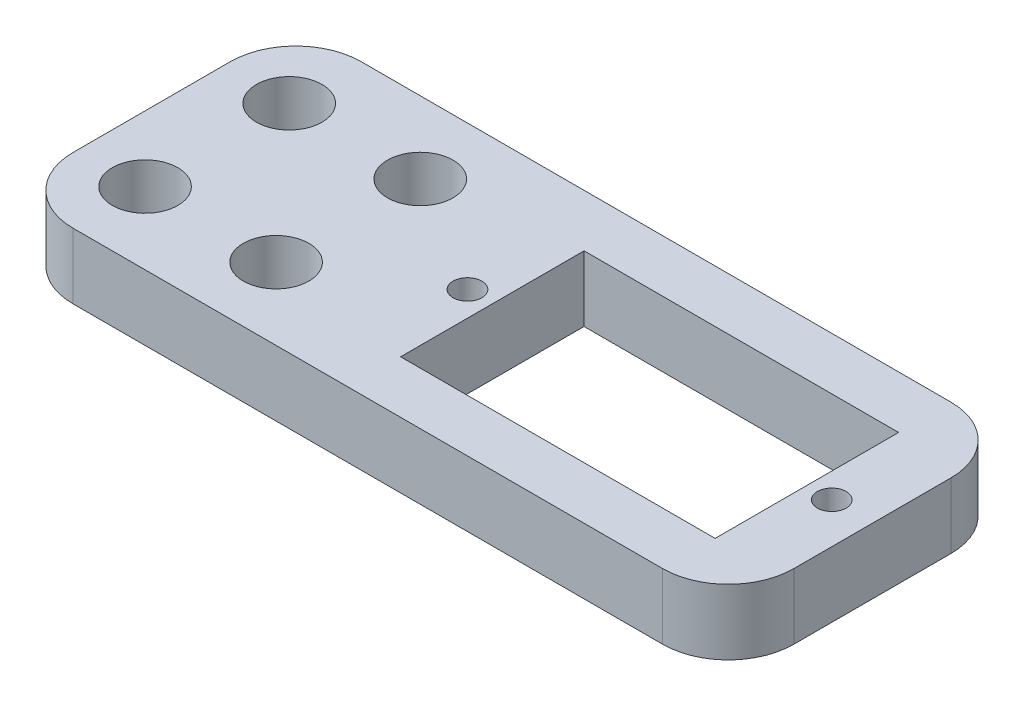
ISO-10303-21;
HEADER;
FILE_DESCRIPTION(('STEP AP214'),'2;1');
FILE_NAME('part.step','',(''),(''),'','','');
FILE_SCHEMA(('AUTOMOTIVE_DESIGN { 1 0 10303 214 1 1 1 1 }'));
ENDSEC;
DATA;
#1=APPLICATION_CONTEXT('core data for automotive mechanical design processes');
#2=APPLICATION_PROTOCOL_DEFINITION('international standard','automotive_design',2000,#1);
#3=PRODUCT_CONTEXT('',#1,'mechanical');
#4=PRODUCT('Part','Part','',(#3));
#5=PRODUCT_RELATED_PRODUCT_CATEGORY('part','',(#4));
#6=PRODUCT_DEFINITION_FORMATION('','',#4);
#7=PRODUCT_DEFINITION_CONTEXT('part definition',#1,'design');
#8=PRODUCT_DEFINITION('design','',#6,#7);
#9=PRODUCT_DEFINITION_SHAPE('','',#8);
#10=(LENGTH_UNIT() NAMED_UNIT(*) SI_UNIT(.MILLI.,.METRE.));
#11=(NAMED_UNIT(*) PLANE_ANGLE_UNIT() SI_UNIT($,.RADIAN.));
#12=(NAMED_UNIT(*) SI_UNIT($,.STERADIAN.) SOLID_ANGLE_UNIT());
#13=UNCERTAINTY_MEASURE_WITH_UNIT(LENGTH_MEASURE(1.E-05),#10,'distance_accuracy_value','');
#14=(GEOMETRIC_REPRESENTATION_CONTEXT(3) GLOBAL_UNCERTAINTY_ASSIGNED_CONTEXT((#13)) GLOBAL_UNIT_ASSIGNED_CONTEXT((#10,
#11,#12)) REPRESENTATION_CONTEXT('',''));
#15=CARTESIAN_POINT('',(0.,0.,0.));
#16=DIRECTION('',(0.,0.,1.));
#17=DIRECTION('',(1.,0.,0.));
#18=AXIS2_PLACEMENT_3D('',#15,#16,#17);
#19=CARTESIAN_POINT('',(0.,5.,0.));
#20=DIRECTION('',(0.,-1.,0.));
#21=DIRECTION('',(0.,0.,-1.));
#22=AXIS2_PLACEMENT_3D('',#19,#20,#21);
#23=PLANE('',#22);
#24=CARTESIAN_POINT('',(21.9,5.,0.));
#25=DIRECTION('',(0.,1.,0.));
#26=DIRECTION('',(0.,0.,1.));
#27=AXIS2_PLACEMENT_3D('',#24,#25,#26);
#28=CIRCLE('',#27,1.1);
#29=CARTESIAN_POINT('',(21.9,5.,1.1));
#30=VERTEX_POINT('',#29);
#31=EDGE_CURVE('E414',#30,#30,#28,.T.);
#32=ORIENTED_EDGE('',*,*,#31,.F.);
#33=EDGE_LOOP('',(#32));
#34=FACE_BOUND('',#33,.T.);
#35=CARTESIAN_POINT('',(-15.,5.,-5.5));
#36=DIRECTION('',(0.,1.,0.));
#37=DIRECTION('',(0.,0.,1.));
#38=AXIS2_PLACEMENT_3D('',#35,#36,#37);
#39=CIRCLE('',#38,2.5);
#40=CARTESIAN_POINT('',(-15.,5.,-3.));
#41=VERTEX_POINT('',#40);
#42=EDGE_CURVE('E173',#41,#41,#39,.F.);
#43=ORIENTED_EDGE('',*,*,#42,.T.);
#44=EDGE_LOOP('',(#43));
#45=FACE_BOUND('',#44,.T.);
#46=CARTESIAN_POINT('',(-25.,5.,5.5));
#47=DIRECTION('',(0.,1.,0.));
#48=DIRECTION('',(0.,0.,1.));
#49=AXIS2_PLACEMENT_3D('',#46,#47,#48);
#50=CIRCLE('',#49,2.5);
#51=CARTESIAN_POINT('',(-25.,5.,8.));
#52=VERTEX_POINT('',#51);
#53=EDGE_CURVE('E166',#52,#52,#50,.F.);
#54=ORIENTED_EDGE('',*,*,#53,.T.);
#55=EDGE_LOOP('',(#54));
#56=FACE_BOUND('',#55,.T.);
#57=DIRECTION('',(-1.,0.,0.));
#58=VECTOR('',#57,1.);
#59=CARTESIAN_POINT('',(-30.,5.,-11.));
#60=LINE('',#59,#58);
#61=CARTESIAN_POINT('',(20.,5.,-11.));
#62=VERTEX_POINT('',#61);
#63=CARTESIAN_POINT('',(-25.,5.,-11.));
#64=VERTEX_POINT('',#63);
#65=EDGE_CURVE('E197',#62,#64,#60,.T.);
#66=ORIENTED_EDGE('',*,*,#65,.T.);
#67=CARTESIAN_POINT('',(-25.,5.,-6.));
#68=DIRECTION('',(0.,-1.,0.));
#69=DIRECTION('',(0.,0.,-1.));
#70=AXIS2_PLACEMENT_3D('',#67,#68,#69);
#71=CIRCLE('',#70,5.);
#72=CARTESIAN_POINT('',(-30.,5.,-6.));
#73=VERTEX_POINT('',#72);
#74=EDGE_CURVE('E234',#64,#73,#71,.F.);
#75=ORIENTED_EDGE('',*,*,#74,.T.);
#76=DIRECTION('',(0.,0.,1.));
#77=VECTOR('',#76,1.);
#78=CARTESIAN_POINT('',(-30.,5.,11.));
#79=LINE('',#78,#77);
#80=CARTESIAN_POINT('',(-30.,5.,6.));
#81=VERTEX_POINT('',#80);
#82=EDGE_CURVE('E187',#73,#81,#79,.T.);
#83=ORIENTED_EDGE('',*,*,#82,.T.);
#84=CARTESIAN_POINT('',(-25.,5.,6.));
#85=DIRECTION('',(0.,-1.,0.));
#86=DIRECTION('',(0.,0.,-1.));
#87=AXIS2_PLACEMENT_3D('',#84,#85,#86);
#88=CIRCLE('',#87,5.);
#89=CARTESIAN_POINT('',(-25.,5.,11.));
#90=VERTEX_POINT('',#89);
#91=EDGE_CURVE('E232',#81,#90,#88,.F.);
#92=ORIENTED_EDGE('',*,*,#91,.T.);
#93=DIRECTION('',(1.,0.,0.));
#94=VECTOR('',#93,1.);
#95=CARTESIAN_POINT('',(-30.,5.,11.));
#96=LINE('',#95,#94);
#97=CARTESIAN_POINT('',(20.,5.,11.));
#98=VERTEX_POINT('',#97);
#99=EDGE_CURVE('E190',#90,#98,#96,.T.);
#100=ORIENTED_EDGE('',*,*,#99,.T.);
#101=CARTESIAN_POINT('',(20.,5.,5.99999999999999));
#102=DIRECTION('',(0.,-1.,0.));
#103=DIRECTION('',(0.,0.,-1.));
#104=AXIS2_PLACEMENT_3D('',#101,#102,#103);
#105=CIRCLE('',#104,5.);
#106=CARTESIAN_POINT('',(25.,5.,5.99999999999999));
#107=VERTEX_POINT('',#106);
#108=EDGE_CURVE('E228',#98,#107,#105,.F.);
#109=ORIENTED_EDGE('',*,*,#108,.T.);
#110=DIRECTION('',(0.,0.,-1.));
#111=VECTOR('',#110,1.);
#112=CARTESIAN_POINT('',(25.,5.,-11.));
#113=LINE('',#112,#111);
#114=CARTESIAN_POINT('',(25.,5.,-6.));
#115=VERTEX_POINT('',#114);
#116=EDGE_CURVE('E194',#107,#115,#113,.T.);
#117=ORIENTED_EDGE('',*,*,#116,.T.);
#118=CARTESIAN_POINT('',(20.,5.,-6.));
#119=DIRECTION('',(0.,-1.,0.));
#120=DIRECTION('',(0.,0.,-1.));
#121=AXIS2_PLACEMENT_3D('',#118,#119,#120);
#122=CIRCLE('',#121,5.);
#123=EDGE_CURVE('E230',#115,#62,#122,.F.);
#124=ORIENTED_EDGE('',*,*,#123,.T.);
#125=EDGE_LOOP('',(#66,#75,#83,#92,#100,#109,#117,#124));
#126=FACE_BOUND('',#125,.T.);
#127=CARTESIAN_POINT('',(-25.,5.,-5.5));
#128=DIRECTION('',(0.,1.,0.));
#129=DIRECTION('',(0.,0.,1.));
#130=AXIS2_PLACEMENT_3D('',#127,#128,#129);
#131=CIRCLE('',#130,2.5);
#132=CARTESIAN_POINT('',(-25.,5.,-3.));
#133=VERTEX_POINT('',#132);
#134=EDGE_CURVE('E172',#133,#133,#131,.T.);
#135=ORIENTED_EDGE('',*,*,#134,.F.);
#136=EDGE_LOOP('',(#135));
#137=FACE_BOUND('',#136,.T.);
#138=CARTESIAN_POINT('',(-15.,5.,5.5));
#139=DIRECTION('',(0.,1.,0.));
#140=DIRECTION('',(0.,0.,1.));
#141=AXIS2_PLACEMENT_3D('',#138,#139,#140);
#142=CIRCLE('',#141,2.5);
#143=CARTESIAN_POINT('',(-15.,5.,8.));
#144=VERTEX_POINT('',#143);
#145=EDGE_CURVE('E140',#144,#144,#142,.T.);
#146=ORIENTED_EDGE('',*,*,#145,.F.);
#147=EDGE_LOOP('',(#146));
#148=FACE_BOUND('',#147,.T.);
#149=DIRECTION('',(1.,0.,0.));
#150=VECTOR('',#149,1.);
#151=CARTESIAN_POINT('',(-4.,5.,-7.));
#152=LINE('',#151,#150);
#153=CARTESIAN_POINT('',(-4.,5.,-7.));
#154=VERTEX_POINT('',#153);
#155=CARTESIAN_POINT('',(20.,5.,-7.));
#156=VERTEX_POINT('',#155);
#157=EDGE_CURVE('E51',#154,#156,#152,.T.);
#158=ORIENTED_EDGE('',*,*,#157,.T.);
#159=DIRECTION('',(0.,0.,-1.));
#160=VECTOR('',#159,1.);
#161=CARTESIAN_POINT('',(20.,5.,7.));
#162=LINE('',#161,#160);
#163=CARTESIAN_POINT('',(20.,5.,7.));
#164=VERTEX_POINT('',#163);
#165=EDGE_CURVE('E139',#164,#156,#162,.T.);
#166=ORIENTED_EDGE('',*,*,#165,.F.);
#167=DIRECTION('',(1.,0.,0.));
#168=VECTOR('',#167,1.);
#169=CARTESIAN_POINT('',(-4.,5.,7.));
#170=LINE('',#169,#168);
#171=CARTESIAN_POINT('',(-4.,5.,7.));
#172=VERTEX_POINT('',#171);
#173=EDGE_CURVE('E154',#172,#164,#170,.T.);
#174=ORIENTED_EDGE('',*,*,#173,.F.);
#175=DIRECTION('',(0.,0.,-1.));
#176=VECTOR('',#175,1.);
#177=CARTESIAN_POINT('',(-4.,5.,7.));
#178=LINE('',#177,#176);
#179=EDGE_CURVE('E133',#172,#154,#178,.T.);
#180=ORIENTED_EDGE('',*,*,#179,.T.);
#181=EDGE_LOOP('',(#158,#166,#174,#180));
#182=FACE_BOUND('',#181,.T.);
#183=CARTESIAN_POINT('',(-5.9,5.,0.));
#184=DIRECTION('',(0.,-1.,0.));
#185=DIRECTION('',(0.,0.,-1.));
#186=AXIS2_PLACEMENT_3D('',#183,#184,#185);
#187=CIRCLE('',#186,1.1);
#188=CARTESIAN_POINT('',(-5.9,5.,-1.1));
#189=VERTEX_POINT('',#188);
#190=EDGE_CURVE('E152',#189,#189,#187,.T.);
#191=ORIENTED_EDGE('',*,*,#190,.T.);
#192=EDGE_LOOP('',(#191));
#193=FACE_BOUND('',#192,.T.);
#194=ADVANCED_FACE('F36',(#34,#45,#56,#126,#137,#148,#182,#193),#23,.F.);
#195=CARTESIAN_POINT('',(0.,0.,0.));
#196=DIRECTION('',(0.,-1.,0.));
#197=DIRECTION('',(0.,0.,-1.));
#198=AXIS2_PLACEMENT_3D('',#195,#196,#197);
#199=PLANE('',#198);
#200=CARTESIAN_POINT('',(21.9,0.,0.));
#201=DIRECTION('',(0.,1.,0.));
#202=DIRECTION('',(0.,0.,1.));
#203=AXIS2_PLACEMENT_3D('',#200,#201,#202);
#204=CIRCLE('',#203,1.1);
#205=CARTESIAN_POINT('',(21.9,0.,1.1));
#206=VERTEX_POINT('',#205);
#207=EDGE_CURVE('E419',#206,#206,#204,.T.);
#208=ORIENTED_EDGE('',*,*,#207,.T.);
#209=EDGE_LOOP('',(#208));
#210=FACE_BOUND('',#209,.T.);
#211=DIRECTION('',(0.,0.,-1.));
#212=VECTOR('',#211,1.);
#213=CARTESIAN_POINT('',(20.,0.,7.));
#214=LINE('',#213,#212);
#215=CARTESIAN_POINT('',(20.,0.,7.));
#216=VERTEX_POINT('',#215);
#217=CARTESIAN_POINT('',(20.,0.,-7.));
#218=VERTEX_POINT('',#217);
#219=EDGE_CURVE('E132',#216,#218,#214,.T.);
#220=ORIENTED_EDGE('',*,*,#219,.T.);
#221=DIRECTION('',(1.,0.,0.));
#222=VECTOR('',#221,1.);
#223=CARTESIAN_POINT('',(-4.,0.,-7.));
#224=LINE('',#223,#222);
#225=CARTESIAN_POINT('',(-4.,0.,-7.));
#226=VERTEX_POINT('',#225);
#227=EDGE_CURVE('E123',#226,#218,#224,.T.);
#228=ORIENTED_EDGE('',*,*,#227,.F.);
#229=DIRECTION('',(0.,0.,-1.));
#230=VECTOR('',#229,1.);
#231=CARTESIAN_POINT('',(-4.,0.,7.));
#232=LINE('',#231,#230);
#233=CARTESIAN_POINT('',(-4.,0.,7.));
#234=VERTEX_POINT('',#233);
#235=EDGE_CURVE('E146',#234,#226,#232,.T.);
#236=ORIENTED_EDGE('',*,*,#235,.F.);
#237=DIRECTION('',(1.,0.,0.));
#238=VECTOR('',#237,1.);
#239=CARTESIAN_POINT('',(-4.,0.,7.));
#240=LINE('',#239,#238);
#241=EDGE_CURVE('E59',#234,#216,#240,.T.);
#242=ORIENTED_EDGE('',*,*,#241,.T.);
#243=EDGE_LOOP('',(#220,#228,#236,#242));
#244=FACE_BOUND('',#243,.T.);
#245=CARTESIAN_POINT('',(-15.,0.,-5.5));
#246=DIRECTION('',(0.,1.,0.));
#247=DIRECTION('',(0.,0.,1.));
#248=AXIS2_PLACEMENT_3D('',#245,#246,#247);
#249=CIRCLE('',#248,2.5);
#250=CARTESIAN_POINT('',(-15.,0.,-3.));
#251=VERTEX_POINT('',#250);
#252=EDGE_CURVE('E169',#251,#251,#249,.F.);
#253=ORIENTED_EDGE('',*,*,#252,.F.);
#254=EDGE_LOOP('',(#253));
#255=FACE_BOUND('',#254,.T.);
#256=DIRECTION('',(0.,0.,1.));
#257=VECTOR('',#256,1.);
#258=CARTESIAN_POINT('',(-30.,0.,11.));
#259=LINE('',#258,#257);
#260=CARTESIAN_POINT('',(-30.,0.,-6.));
#261=VERTEX_POINT('',#260);
#262=CARTESIAN_POINT('',(-30.,0.,6.));
#263=VERTEX_POINT('',#262);
#264=EDGE_CURVE('E184',#261,#263,#259,.T.);
#265=ORIENTED_EDGE('',*,*,#264,.F.);
#266=CARTESIAN_POINT('',(-25.,0.,-6.));
#267=DIRECTION('',(0.,-1.,0.));
#268=DIRECTION('',(0.,0.,-1.));
#269=AXIS2_PLACEMENT_3D('',#266,#267,#268);
#270=CIRCLE('',#269,5.);
#271=CARTESIAN_POINT('',(-25.,0.,-11.));
#272=VERTEX_POINT('',#271);
#273=EDGE_CURVE('E221',#261,#272,#270,.T.);
#274=ORIENTED_EDGE('',*,*,#273,.T.);
#275=DIRECTION('',(-1.,0.,0.));
#276=VECTOR('',#275,1.);
#277=CARTESIAN_POINT('',(-30.,0.,-11.));
#278=LINE('',#277,#276);
#279=CARTESIAN_POINT('',(20.,0.,-11.));
#280=VERTEX_POINT('',#279);
#281=EDGE_CURVE('E191',#280,#272,#278,.T.);
#282=ORIENTED_EDGE('',*,*,#281,.F.);
#283=CARTESIAN_POINT('',(20.,0.,-6.));
#284=DIRECTION('',(0.,-1.,0.));
#285=DIRECTION('',(0.,0.,-1.));
#286=AXIS2_PLACEMENT_3D('',#283,#284,#285);
#287=CIRCLE('',#286,5.);
#288=CARTESIAN_POINT('',(25.,0.,-6.));
#289=VERTEX_POINT('',#288);
#290=EDGE_CURVE('E217',#280,#289,#287,.T.);
#291=ORIENTED_EDGE('',*,*,#290,.T.);
#292=DIRECTION('',(0.,0.,-1.));
#293=VECTOR('',#292,1.);
#294=CARTESIAN_POINT('',(25.,0.,-11.));
#295=LINE('',#294,#293);
#296=CARTESIAN_POINT('',(25.,0.,5.99999999999999));
#297=VERTEX_POINT('',#296);
#298=EDGE_CURVE('E206',#297,#289,#295,.T.);
#299=ORIENTED_EDGE('',*,*,#298,.F.);
#300=CARTESIAN_POINT('',(20.,0.,5.99999999999999));
#301=DIRECTION('',(0.,-1.,0.));
#302=DIRECTION('',(0.,0.,-1.));
#303=AXIS2_PLACEMENT_3D('',#300,#301,#302);
#304=CIRCLE('',#303,5.);
#305=CARTESIAN_POINT('',(20.,0.,11.));
#306=VERTEX_POINT('',#305);
#307=EDGE_CURVE('E215',#297,#306,#304,.T.);
#308=ORIENTED_EDGE('',*,*,#307,.T.);
#309=DIRECTION('',(1.,0.,0.));
#310=VECTOR('',#309,1.);
#311=CARTESIAN_POINT('',(-30.,0.,11.));
#312=LINE('',#311,#310);
#313=CARTESIAN_POINT('',(-25.,0.,11.));
#314=VERTEX_POINT('',#313);
#315=EDGE_CURVE('E203',#314,#306,#312,.T.);
#316=ORIENTED_EDGE('',*,*,#315,.F.);
#317=CARTESIAN_POINT('',(-25.,0.,6.));
#318=DIRECTION('',(0.,-1.,0.));
#319=DIRECTION('',(0.,0.,-1.));
#320=AXIS2_PLACEMENT_3D('',#317,#318,#319);
#321=CIRCLE('',#320,5.);
#322=EDGE_CURVE('E219',#314,#263,#321,.T.);
#323=ORIENTED_EDGE('',*,*,#322,.T.);
#324=EDGE_LOOP('',(#265,#274,#282,#291,#299,#308,#316,#323));
#325=FACE_BOUND('',#324,.T.);
#326=CARTESIAN_POINT('',(-25.,0.,-5.5));
#327=DIRECTION('',(0.,1.,0.));
#328=DIRECTION('',(0.,0.,1.));
#329=AXIS2_PLACEMENT_3D('',#326,#327,#328);
#330=CIRCLE('',#329,2.5);
#331=CARTESIAN_POINT('',(-25.,0.,-3.));
#332=VERTEX_POINT('',#331);
#333=EDGE_CURVE('E181',#332,#332,#330,.T.);
#334=ORIENTED_EDGE('',*,*,#333,.T.);
#335=EDGE_LOOP('',(#334));
#336=FACE_BOUND('',#335,.T.);
#337=CARTESIAN_POINT('',(-15.,0.,5.5));
#338=DIRECTION('',(0.,1.,0.));
#339=DIRECTION('',(0.,0.,1.));
#340=AXIS2_PLACEMENT_3D('',#337,#338,#339);
#341=CIRCLE('',#340,2.5);
#342=CARTESIAN_POINT('',(-15.,0.,8.));
#343=VERTEX_POINT('',#342);
#344=EDGE_CURVE('E163',#343,#343,#341,.T.);
#345=ORIENTED_EDGE('',*,*,#344,.T.);
#346=EDGE_LOOP('',(#345));
#347=FACE_BOUND('',#346,.T.);
#348=CARTESIAN_POINT('',(-25.,0.,5.5));
#349=DIRECTION('',(0.,1.,0.));
#350=DIRECTION('',(0.,0.,1.));
#351=AXIS2_PLACEMENT_3D('',#348,#349,#350);
#352=CIRCLE('',#351,2.5);
#353=CARTESIAN_POINT('',(-25.,0.,8.));
#354=VERTEX_POINT('',#353);
#355=EDGE_CURVE('E176',#354,#354,#352,.F.);
#356=ORIENTED_EDGE('',*,*,#355,.F.);
#357=EDGE_LOOP('',(#356));
#358=FACE_BOUND('',#357,.T.);
#359=CARTESIAN_POINT('',(-5.9,0.,0.));
#360=DIRECTION('',(0.,-1.,0.));
#361=DIRECTION('',(0.,0.,-1.));
#362=AXIS2_PLACEMENT_3D('',#359,#360,#361);
#363=CIRCLE('',#362,1.1);
#364=CARTESIAN_POINT('',(-5.9,0.,-1.1));
#365=VERTEX_POINT('',#364);
#366=EDGE_CURVE('E413',#365,#365,#363,.T.);
#367=ORIENTED_EDGE('',*,*,#366,.F.);
#368=EDGE_LOOP('',(#367));
#369=FACE_BOUND('',#368,.T.);
#370=ADVANCED_FACE('F143',(#210,#244,#255,#325,#336,#347,#358,#369),#199,.T.);
#371=CARTESIAN_POINT('',(-30.,5.,11.));
#372=DIRECTION('',(1.,0.,0.));
#373=DIRECTION('',(0.,0.,-1.));
#374=AXIS2_PLACEMENT_3D('',#371,#372,#373);
#375=PLANE('',#374);
#376=ORIENTED_EDGE('',*,*,#82,.F.);
#377=DIRECTION('',(0.,-1.,0.));
#378=VECTOR('',#377,1.);
#379=CARTESIAN_POINT('',(-30.,5.,-6.));
#380=LINE('',#379,#378);
#381=EDGE_CURVE('E212',#73,#261,#380,.T.);
#382=ORIENTED_EDGE('',*,*,#381,.T.);
#383=ORIENTED_EDGE('',*,*,#264,.T.);
#384=DIRECTION('',(0.,-1.,0.));
#385=VECTOR('',#384,1.);
#386=CARTESIAN_POINT('',(-30.,5.,6.));
#387=LINE('',#386,#385);
#388=EDGE_CURVE('E200',#263,#81,#387,.F.);
#389=ORIENTED_EDGE('',*,*,#388,.T.);
#390=EDGE_LOOP('',(#376,#382,#383,#389));
#391=FACE_BOUND('',#390,.T.);
#392=ADVANCED_FACE('F270',(#391),#375,.F.);
#393=CARTESIAN_POINT('',(-30.,5.,11.));
#394=DIRECTION('',(0.,0.,-1.));
#395=DIRECTION('',(-1.,0.,0.));
#396=AXIS2_PLACEMENT_3D('',#393,#394,#395);
#397=PLANE('',#396);
#398=ORIENTED_EDGE('',*,*,#99,.F.);
#399=DIRECTION('',(0.,-1.,0.));
#400=VECTOR('',#399,1.);
#401=CARTESIAN_POINT('',(-25.,5.,11.));
#402=LINE('',#401,#400);
#403=EDGE_CURVE('E238',#90,#314,#402,.T.);
#404=ORIENTED_EDGE('',*,*,#403,.T.);
#405=ORIENTED_EDGE('',*,*,#315,.T.);
#406=DIRECTION('',(0.,-1.,0.));
#407=VECTOR('',#406,1.);
#408=CARTESIAN_POINT('',(20.,5.,11.));
#409=LINE('',#408,#407);
#410=EDGE_CURVE('E236',#306,#98,#409,.F.);
#411=ORIENTED_EDGE('',*,*,#410,.T.);
#412=EDGE_LOOP('',(#398,#404,#405,#411));
#413=FACE_BOUND('',#412,.T.);
#414=ADVANCED_FACE('F278',(#413),#397,.F.);
#415=CARTESIAN_POINT('',(25.,5.,-11.));
#416=DIRECTION('',(-1.,0.,0.));
#417=DIRECTION('',(0.,0.,1.));
#418=AXIS2_PLACEMENT_3D('',#415,#416,#417);
#419=PLANE('',#418);
#420=ORIENTED_EDGE('',*,*,#298,.T.);
#421=DIRECTION('',(0.,-1.,0.));
#422=VECTOR('',#421,1.);
#423=CARTESIAN_POINT('',(25.,5.,-6.));
#424=LINE('',#423,#422);
#425=EDGE_CURVE('E11',#289,#115,#424,.F.);
#426=ORIENTED_EDGE('',*,*,#425,.T.);
#427=ORIENTED_EDGE('',*,*,#116,.F.);
#428=DIRECTION('',(0.,-1.,0.));
#429=VECTOR('',#428,1.);
#430=CARTESIAN_POINT('',(25.,5.,5.99999999999999));
#431=LINE('',#430,#429);
#432=EDGE_CURVE('E44',#107,#297,#431,.T.);
#433=ORIENTED_EDGE('',*,*,#432,.T.);
#434=EDGE_LOOP('',(#420,#426,#427,#433));
#435=FACE_BOUND('',#434,.T.);
#436=ADVANCED_FACE('F245',(#435),#419,.F.);
#437=CARTESIAN_POINT('',(-30.,5.,-11.));
#438=DIRECTION('',(0.,0.,1.));
#439=DIRECTION('',(1.,0.,0.));
#440=AXIS2_PLACEMENT_3D('',#437,#438,#439);
#441=PLANE('',#440);
#442=ORIENTED_EDGE('',*,*,#281,.T.);
#443=DIRECTION('',(0.,-1.,0.));
#444=VECTOR('',#443,1.);
#445=CARTESIAN_POINT('',(-25.,5.,-11.));
#446=LINE('',#445,#444);
#447=EDGE_CURVE('E226',#272,#64,#446,.F.);
#448=ORIENTED_EDGE('',*,*,#447,.T.);
#449=ORIENTED_EDGE('',*,*,#65,.F.);
#450=DIRECTION('',(0.,-1.,0.));
#451=VECTOR('',#450,1.);
#452=CARTESIAN_POINT('',(20.,5.,-11.));
#453=LINE('',#452,#451);
#454=EDGE_CURVE('E223',#62,#280,#453,.T.);
#455=ORIENTED_EDGE('',*,*,#454,.T.);
#456=EDGE_LOOP('',(#442,#448,#449,#455));
#457=FACE_BOUND('',#456,.T.);
#458=ADVANCED_FACE('F260',(#457),#441,.F.);
#459=CARTESIAN_POINT('',(-25.,0.,-5.5));
#460=DIRECTION('',(0.,1.,0.));
#461=DIRECTION('',(0.,0.,1.));
#462=AXIS2_PLACEMENT_3D('',#459,#460,#461);
#463=CYLINDRICAL_SURFACE('',#462,2.5);
#464=ORIENTED_EDGE('',*,*,#333,.F.);
#465=EDGE_LOOP('',(#464));
#466=FACE_BOUND('',#465,.T.);
#467=ORIENTED_EDGE('',*,*,#134,.T.);
#468=EDGE_LOOP('',(#467));
#469=FACE_BOUND('',#468,.T.);
#470=ADVANCED_FACE('F297',(#466,#469),#463,.F.);
#471=CARTESIAN_POINT('',(-15.,0.,5.5));
#472=DIRECTION('',(0.,1.,0.));
#473=DIRECTION('',(0.,0.,1.));
#474=AXIS2_PLACEMENT_3D('',#471,#472,#473);
#475=CYLINDRICAL_SURFACE('',#474,2.5);
#476=ORIENTED_EDGE('',*,*,#344,.F.);
#477=EDGE_LOOP('',(#476));
#478=FACE_BOUND('',#477,.T.);
#479=ORIENTED_EDGE('',*,*,#145,.T.);
#480=EDGE_LOOP('',(#479));
#481=FACE_BOUND('',#480,.T.);
#482=ADVANCED_FACE('F395',(#478,#481),#475,.F.);
#483=CARTESIAN_POINT('',(-25.,0.,5.5));
#484=DIRECTION('',(0.,1.,0.));
#485=DIRECTION('',(0.,0.,1.));
#486=AXIS2_PLACEMENT_3D('',#483,#484,#485);
#487=CYLINDRICAL_SURFACE('',#486,2.5);
#488=ORIENTED_EDGE('',*,*,#355,.T.);
#489=EDGE_LOOP('',(#488));
#490=FACE_BOUND('',#489,.T.);
#491=ORIENTED_EDGE('',*,*,#53,.F.);
#492=EDGE_LOOP('',(#491));
#493=FACE_BOUND('',#492,.T.);
#494=ADVANCED_FACE('F398',(#490,#493),#487,.F.);
#495=CARTESIAN_POINT('',(-15.,0.,-5.5));
#496=DIRECTION('',(0.,1.,0.));
#497=DIRECTION('',(0.,0.,1.));
#498=AXIS2_PLACEMENT_3D('',#495,#496,#497);
#499=CYLINDRICAL_SURFACE('',#498,2.5);
#500=ORIENTED_EDGE('',*,*,#252,.T.);
#501=EDGE_LOOP('',(#500));
#502=FACE_BOUND('',#501,.T.);
#503=ORIENTED_EDGE('',*,*,#42,.F.);
#504=EDGE_LOOP('',(#503));
#505=FACE_BOUND('',#504,.T.);
#506=ADVANCED_FACE('F310',(#502,#505),#499,.F.);
#507=CARTESIAN_POINT('',(-25.,5.,-6.));
#508=DIRECTION('',(0.,-1.,0.));
#509=DIRECTION('',(0.,0.,-1.));
#510=AXIS2_PLACEMENT_3D('',#507,#508,#509);
#511=CYLINDRICAL_SURFACE('',#510,5.);
#512=ORIENTED_EDGE('',*,*,#74,.F.);
#513=ORIENTED_EDGE('',*,*,#447,.F.);
#514=ORIENTED_EDGE('',*,*,#273,.F.);
#515=ORIENTED_EDGE('',*,*,#381,.F.);
#516=EDGE_LOOP('',(#512,#513,#514,#515));
#517=FACE_BOUND('',#516,.T.);
#518=ADVANCED_FACE('F268',(#517),#511,.T.);
#519=CARTESIAN_POINT('',(-25.,5.,6.));
#520=DIRECTION('',(0.,-1.,0.));
#521=DIRECTION('',(0.,0.,-1.));
#522=AXIS2_PLACEMENT_3D('',#519,#520,#521);
#523=CYLINDRICAL_SURFACE('',#522,5.);
#524=ORIENTED_EDGE('',*,*,#91,.F.);
#525=ORIENTED_EDGE('',*,*,#388,.F.);
#526=ORIENTED_EDGE('',*,*,#322,.F.);
#527=ORIENTED_EDGE('',*,*,#403,.F.);
#528=EDGE_LOOP('',(#524,#525,#526,#527));
#529=FACE_BOUND('',#528,.T.);
#530=ADVANCED_FACE('F275',(#529),#523,.T.);
#531=CARTESIAN_POINT('',(20.,5.,-6.));
#532=DIRECTION('',(0.,-1.,0.));
#533=DIRECTION('',(0.,0.,-1.));
#534=AXIS2_PLACEMENT_3D('',#531,#532,#533);
#535=CYLINDRICAL_SURFACE('',#534,5.);
#536=ORIENTED_EDGE('',*,*,#123,.F.);
#537=ORIENTED_EDGE('',*,*,#425,.F.);
#538=ORIENTED_EDGE('',*,*,#290,.F.);
#539=ORIENTED_EDGE('',*,*,#454,.F.);
#540=EDGE_LOOP('',(#536,#537,#538,#539));
#541=FACE_BOUND('',#540,.T.);
#542=ADVANCED_FACE('F257',(#541),#535,.T.);
#543=CARTESIAN_POINT('',(20.,5.,5.99999999999999));
#544=DIRECTION('',(0.,-1.,0.));
#545=DIRECTION('',(0.,0.,-1.));
#546=AXIS2_PLACEMENT_3D('',#543,#544,#545);
#547=CYLINDRICAL_SURFACE('',#546,5.);
#548=ORIENTED_EDGE('',*,*,#108,.F.);
#549=ORIENTED_EDGE('',*,*,#410,.F.);
#550=ORIENTED_EDGE('',*,*,#307,.F.);
#551=ORIENTED_EDGE('',*,*,#432,.F.);
#552=EDGE_LOOP('',(#548,#549,#550,#551));
#553=FACE_BOUND('',#552,.T.);
#554=ADVANCED_FACE('F38',(#553),#547,.T.);
#555=CARTESIAN_POINT('',(-4.,0.,-7.));
#556=DIRECTION('',(0.,0.,1.));
#557=DIRECTION('',(1.,0.,0.));
#558=AXIS2_PLACEMENT_3D('',#555,#556,#557);
#559=PLANE('',#558);
#560=ORIENTED_EDGE('',*,*,#157,.F.);
#561=DIRECTION('',(0.,1.,0.));
#562=VECTOR('',#561,1.);
#563=CARTESIAN_POINT('',(-4.,0.,-7.));
#564=LINE('',#563,#562);
#565=EDGE_CURVE('E128',#226,#154,#564,.T.);
#566=ORIENTED_EDGE('',*,*,#565,.F.);
#567=ORIENTED_EDGE('',*,*,#227,.T.);
#568=DIRECTION('',(0.,1.,0.));
#569=VECTOR('',#568,1.);
#570=CARTESIAN_POINT('',(20.,0.,-7.));
#571=LINE('',#570,#569);
#572=EDGE_CURVE('E126',#218,#156,#571,.T.);
#573=ORIENTED_EDGE('',*,*,#572,.T.);
#574=EDGE_LOOP('',(#560,#566,#567,#573));
#575=FACE_BOUND('',#574,.T.);
#576=ADVANCED_FACE('F125',(#575),#559,.T.);
#577=CARTESIAN_POINT('',(20.,0.,7.));
#578=DIRECTION('',(1.,0.,0.));
#579=DIRECTION('',(0.,0.,-1.));
#580=AXIS2_PLACEMENT_3D('',#577,#578,#579);
#581=PLANE('',#580);
#582=ORIENTED_EDGE('',*,*,#165,.T.);
#583=ORIENTED_EDGE('',*,*,#572,.F.);
#584=ORIENTED_EDGE('',*,*,#219,.F.);
#585=DIRECTION('',(0.,1.,0.));
#586=VECTOR('',#585,1.);
#587=CARTESIAN_POINT('',(20.,0.,7.));
#588=LINE('',#587,#586);
#589=EDGE_CURVE('E141',#216,#164,#588,.T.);
#590=ORIENTED_EDGE('',*,*,#589,.T.);
#591=EDGE_LOOP('',(#582,#583,#584,#590));
#592=FACE_BOUND('',#591,.T.);
#593=ADVANCED_FACE('F137',(#592),#581,.F.);
#594=CARTESIAN_POINT('',(-4.,0.,7.));
#595=DIRECTION('',(0.,0.,1.));
#596=DIRECTION('',(1.,0.,0.));
#597=AXIS2_PLACEMENT_3D('',#594,#595,#596);
#598=PLANE('',#597);
#599=ORIENTED_EDGE('',*,*,#173,.T.);
#600=ORIENTED_EDGE('',*,*,#589,.F.);
#601=ORIENTED_EDGE('',*,*,#241,.F.);
#602=DIRECTION('',(0.,1.,0.));
#603=VECTOR('',#602,1.);
#604=CARTESIAN_POINT('',(-4.,0.,7.));
#605=LINE('',#604,#603);
#606=EDGE_CURVE('E160',#234,#172,#605,.T.);
#607=ORIENTED_EDGE('',*,*,#606,.T.);
#608=EDGE_LOOP('',(#599,#600,#601,#607));
#609=FACE_BOUND('',#608,.T.);
#610=ADVANCED_FACE('F350',(#609),#598,.F.);
#611=CARTESIAN_POINT('',(-4.,0.,7.));
#612=DIRECTION('',(1.,0.,0.));
#613=DIRECTION('',(0.,0.,-1.));
#614=AXIS2_PLACEMENT_3D('',#611,#612,#613);
#615=PLANE('',#614);
#616=ORIENTED_EDGE('',*,*,#179,.F.);
#617=ORIENTED_EDGE('',*,*,#606,.F.);
#618=ORIENTED_EDGE('',*,*,#235,.T.);
#619=ORIENTED_EDGE('',*,*,#565,.T.);
#620=EDGE_LOOP('',(#616,#617,#618,#619));
#621=FACE_BOUND('',#620,.T.);
#622=ADVANCED_FACE('F359',(#621),#615,.T.);
#623=CARTESIAN_POINT('',(-5.9,0.,0.));
#624=DIRECTION('',(0.,1.,0.));
#625=DIRECTION('',(0.,0.,1.));
#626=AXIS2_PLACEMENT_3D('',#623,#624,#625);
#627=CYLINDRICAL_SURFACE('',#626,1.1);
#628=ORIENTED_EDGE('',*,*,#366,.T.);
#629=EDGE_LOOP('',(#628));
#630=FACE_BOUND('',#629,.T.);
#631=ORIENTED_EDGE('',*,*,#190,.F.);
#632=EDGE_LOOP('',(#631));
#633=FACE_BOUND('',#632,.T.);
#634=ADVANCED_FACE('F368',(#630,#633),#627,.F.);
#635=CARTESIAN_POINT('',(21.9,0.,0.));
#636=DIRECTION('',(0.,1.,0.));
#637=DIRECTION('',(0.,0.,1.));
#638=AXIS2_PLACEMENT_3D('',#635,#636,#637);
#639=CYLINDRICAL_SURFACE('',#638,1.1);
#640=ORIENTED_EDGE('',*,*,#207,.F.);
#641=EDGE_LOOP('',(#640));
#642=FACE_BOUND('',#641,.T.);
#643=ORIENTED_EDGE('',*,*,#31,.T.);
#644=EDGE_LOOP('',(#643));
#645=FACE_BOUND('',#644,.T.);
#646=ADVANCED_FACE('F378',(#642,#645),#639,.F.);
#647=CLOSED_SHELL('',(#194,#370,#392,#414,#436,#458,#470,#482,#494,#506,#518,#530,#542,#554,
#576,#593,#610,#622,#634,#646));
#648=MANIFOLD_SOLID_BREP('B2',#647);
#649=ADVANCED_BREP_SHAPE_REPRESENTATION('',(#18,#648),#14);
#650=SHAPE_DEFINITION_REPRESENTATION(#9,#649);
ENDSEC;
END-ISO-10303-21;
